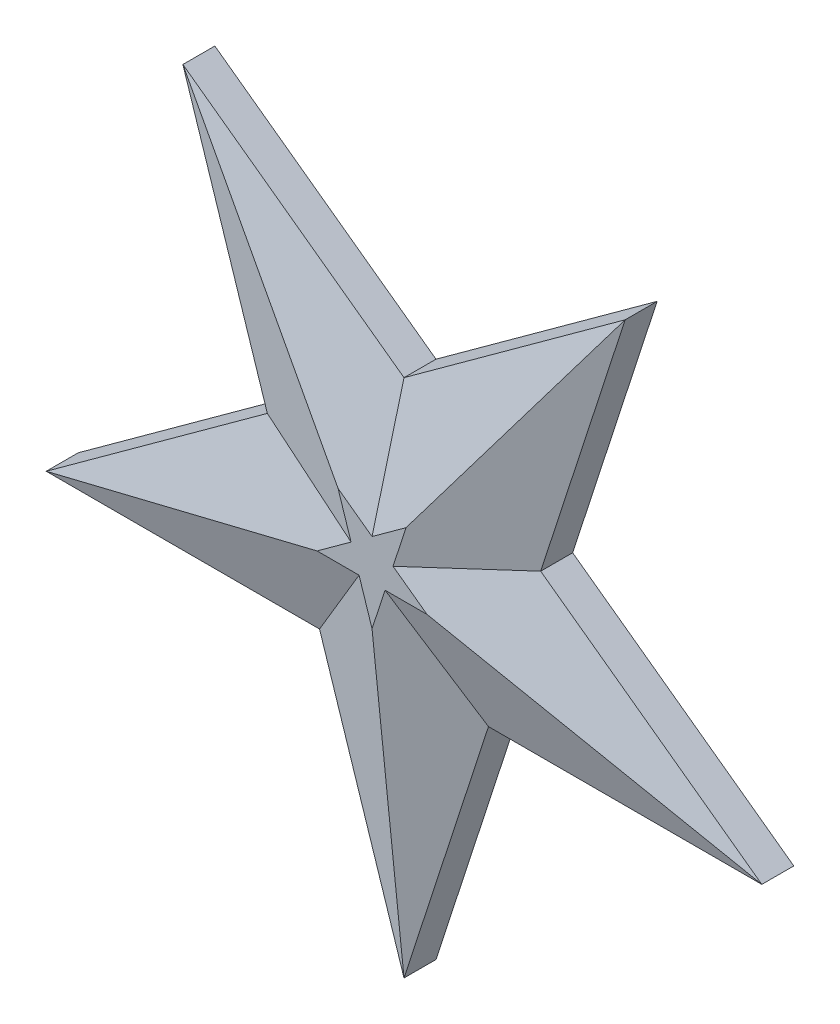
ISO-10303-21;
HEADER;
FILE_DESCRIPTION(('STEP AP214'),'2;1');
FILE_NAME('part.step','',(''),(''),'','','');
FILE_SCHEMA(('AUTOMOTIVE_DESIGN { 1 0 10303 214 1 1 1 1 }'));
ENDSEC;
DATA;
#1=APPLICATION_CONTEXT('core data for automotive mechanical design processes');
#2=APPLICATION_PROTOCOL_DEFINITION('international standard','automotive_design',2000,#1);
#3=PRODUCT_CONTEXT('',#1,'mechanical');
#4=PRODUCT('Part','Part','',(#3));
#5=PRODUCT_RELATED_PRODUCT_CATEGORY('part','',(#4));
#6=PRODUCT_DEFINITION_FORMATION('','',#4);
#7=PRODUCT_DEFINITION_CONTEXT('part definition',#1,'design');
#8=PRODUCT_DEFINITION('design','',#6,#7);
#9=PRODUCT_DEFINITION_SHAPE('','',#8);
#10=(LENGTH_UNIT() NAMED_UNIT(*) SI_UNIT(.MILLI.,.METRE.));
#11=(NAMED_UNIT(*) PLANE_ANGLE_UNIT() SI_UNIT($,.RADIAN.));
#12=(NAMED_UNIT(*) SI_UNIT($,.STERADIAN.) SOLID_ANGLE_UNIT());
#13=UNCERTAINTY_MEASURE_WITH_UNIT(LENGTH_MEASURE(1.E-05),#10,'distance_accuracy_value','');
#14=(GEOMETRIC_REPRESENTATION_CONTEXT(3) GLOBAL_UNCERTAINTY_ASSIGNED_CONTEXT((#13)) GLOBAL_UNIT_ASSIGNED_CONTEXT((#10,
#11,#12)) REPRESENTATION_CONTEXT('',''));
#15=CARTESIAN_POINT('',(0.,0.,0.));
#16=DIRECTION('',(0.,0.,1.));
#17=DIRECTION('',(1.,0.,0.));
#18=AXIS2_PLACEMENT_3D('',#15,#16,#17);
#19=CARTESIAN_POINT('',(-1.06643091403094,-18.9746547741655,2.));
#20=DIRECTION('',(-0.951056516295157,0.309016994374938,0.));
#21=DIRECTION('',(-0.309016994374938,-0.951056516295157,0.));
#22=AXIS2_PLACEMENT_3D('',#19,#20,#21);
#23=PLANE('',#22);
#24=DIRECTION('',(0.309016994374938,0.951056516295157,0.));
#25=VECTOR('',#24,1.);
#26=CARTESIAN_POINT('',(-1.06643091403094,-18.9746547741655,0.));
#27=LINE('',#26,#25);
#28=CARTESIAN_POINT('',(-6.35028036781786,-35.2366712509985,0.));
#29=VERTEX_POINT('',#28);
#30=CARTESIAN_POINT('',(-1.06643091403094,-18.9746547741655,0.));
#31=VERTEX_POINT('',#30);
#32=EDGE_CURVE('E158',#29,#31,#27,.T.);
#33=ORIENTED_EDGE('',*,*,#32,.T.);
#34=DIRECTION('',(0.,0.,-1.));
#35=VECTOR('',#34,1.);
#36=CARTESIAN_POINT('',(-1.06643091403094,-18.9746547741655,2.));
#37=LINE('',#36,#35);
#38=CARTESIAN_POINT('',(-1.06643091403094,-18.9746547741655,2.));
#39=VERTEX_POINT('',#38);
#40=EDGE_CURVE('E11',#39,#31,#37,.T.);
#41=ORIENTED_EDGE('',*,*,#40,.F.);
#42=DIRECTION('',(0.309016994374938,0.951056516295157,0.));
#43=VECTOR('',#42,1.);
#44=CARTESIAN_POINT('',(-1.06643091403094,-18.9746547741655,2.));
#45=LINE('',#44,#43);
#46=CARTESIAN_POINT('',(-6.35028036781785,-35.2366712509985,2.));
#47=VERTEX_POINT('',#46);
#48=EDGE_CURVE('E193',#47,#39,#45,.T.);
#49=ORIENTED_EDGE('',*,*,#48,.F.);
#50=DIRECTION('',(0.,0.,-1.));
#51=VECTOR('',#50,1.);
#52=CARTESIAN_POINT('',(-6.35028036781786,-35.2366712509985,2.));
#53=LINE('',#52,#51);
#54=EDGE_CURVE('E212',#47,#29,#53,.T.);
#55=ORIENTED_EDGE('',*,*,#54,.T.);
#56=EDGE_LOOP('',(#33,#41,#49,#55));
#57=FACE_BOUND('',#56,.T.);
#58=ADVANCED_FACE('F33',(#57),#23,.F.);
#59=CARTESIAN_POINT('',(16.032465101299,-18.9746547741653,2.));
#60=DIRECTION('',(0.,1.,0.));
#61=DIRECTION('',(-1.,0.,0.));
#62=AXIS2_PLACEMENT_3D('',#59,#60,#61);
#63=PLANE('',#62);
#64=DIRECTION('',(1.,0.,0.));
#65=VECTOR('',#64,1.);
#66=CARTESIAN_POINT('',(16.032465101299,-18.9746547741653,0.));
#67=LINE('',#66,#65);
#68=CARTESIAN_POINT('',(16.032465101299,-18.9746547741653,0.));
#69=VERTEX_POINT('',#68);
#70=EDGE_CURVE('E215',#31,#69,#67,.T.);
#71=ORIENTED_EDGE('',*,*,#70,.T.);
#72=DIRECTION('',(0.,0.,-1.));
#73=VECTOR('',#72,1.);
#74=CARTESIAN_POINT('',(16.032465101299,-18.9746547741653,2.));
#75=LINE('',#74,#73);
#76=CARTESIAN_POINT('',(16.032465101299,-18.9746547741653,2.));
#77=VERTEX_POINT('',#76);
#78=EDGE_CURVE('E41',#77,#69,#75,.T.);
#79=ORIENTED_EDGE('',*,*,#78,.F.);
#80=DIRECTION('',(1.,0.,0.));
#81=VECTOR('',#80,1.);
#82=CARTESIAN_POINT('',(16.032465101299,-18.9746547741653,2.));
#83=LINE('',#82,#81);
#84=EDGE_CURVE('E97',#39,#77,#83,.T.);
#85=ORIENTED_EDGE('',*,*,#84,.F.);
#86=ORIENTED_EDGE('',*,*,#40,.T.);
#87=EDGE_LOOP('',(#71,#79,#85,#86));
#88=FACE_BOUND('',#87,.T.);
#89=ADVANCED_FACE('F333',(#88),#63,.F.);
#90=CARTESIAN_POINT('',(2.19916763984696,-8.92417586587219,2.));
#91=DIRECTION('',(-0.587785252292459,-0.809016994374958,0.));
#92=DIRECTION('',(0.809016994374958,-0.587785252292459,0.));
#93=AXIS2_PLACEMENT_3D('',#90,#91,#92);
#94=PLANE('',#93);
#95=DIRECTION('',(-0.809016994374958,0.587785252292459,0.));
#96=VECTOR('',#95,1.);
#97=CARTESIAN_POINT('',(2.19916763984696,-8.92417586587219,0.));
#98=LINE('',#97,#96);
#99=CARTESIAN_POINT('',(2.19916763984696,-8.92417586587219,0.));
#100=VERTEX_POINT('',#99);
#101=EDGE_CURVE('E217',#69,#100,#98,.T.);
#102=ORIENTED_EDGE('',*,*,#101,.T.);
#103=DIRECTION('',(0.,0.,-1.));
#104=VECTOR('',#103,1.);
#105=CARTESIAN_POINT('',(2.19916763984696,-8.92417586587219,2.));
#106=LINE('',#105,#104);
#107=CARTESIAN_POINT('',(2.19916763984696,-8.92417586587219,2.));
#108=VERTEX_POINT('',#107);
#109=EDGE_CURVE('E240',#108,#100,#106,.T.);
#110=ORIENTED_EDGE('',*,*,#109,.F.);
#111=DIRECTION('',(-0.809016994374958,0.587785252292459,0.));
#112=VECTOR('',#111,1.);
#113=CARTESIAN_POINT('',(2.19916763984696,-8.92417586587219,2.));
#114=LINE('',#113,#112);
#115=EDGE_CURVE('E197',#77,#108,#114,.T.);
#116=ORIENTED_EDGE('',*,*,#115,.F.);
#117=ORIENTED_EDGE('',*,*,#78,.T.);
#118=EDGE_LOOP('',(#102,#110,#116,#117));
#119=FACE_BOUND('',#118,.T.);
#120=ADVANCED_FACE('F246',(#119),#94,.F.);
#121=CARTESIAN_POINT('',(7.4830170936339,7.33784061096036,2.));
#122=DIRECTION('',(-0.951056516295154,0.309016994374947,0.));
#123=DIRECTION('',(-0.309016994374947,-0.951056516295154,0.));
#124=AXIS2_PLACEMENT_3D('',#121,#122,#123);
#125=PLANE('',#124);
#126=DIRECTION('',(0.309016994374947,0.951056516295154,0.));
#127=VECTOR('',#126,1.);
#128=CARTESIAN_POINT('',(7.4830170936339,7.33784061096036,0.));
#129=LINE('',#128,#127);
#130=CARTESIAN_POINT('',(7.4830170936339,7.33784061096036,0.));
#131=VERTEX_POINT('',#130);
#132=EDGE_CURVE('E219',#100,#131,#129,.T.);
#133=ORIENTED_EDGE('',*,*,#132,.T.);
#134=DIRECTION('',(0.,0.,-1.));
#135=VECTOR('',#134,1.);
#136=CARTESIAN_POINT('',(7.4830170936339,7.33784061096036,2.));
#137=LINE('',#136,#135);
#138=CARTESIAN_POINT('',(7.4830170936339,7.33784061096036,2.));
#139=VERTEX_POINT('',#138);
#140=EDGE_CURVE('E237',#139,#131,#137,.T.);
#141=ORIENTED_EDGE('',*,*,#140,.F.);
#142=DIRECTION('',(0.309016994374947,0.951056516295154,0.));
#143=VECTOR('',#142,1.);
#144=CARTESIAN_POINT('',(7.4830170936339,7.33784061096036,2.));
#145=LINE('',#144,#143);
#146=EDGE_CURVE('E200',#108,#139,#145,.T.);
#147=ORIENTED_EDGE('',*,*,#146,.F.);
#148=ORIENTED_EDGE('',*,*,#109,.T.);
#149=EDGE_LOOP('',(#133,#141,#147,#148));
#150=FACE_BOUND('',#149,.T.);
#151=ADVANCED_FACE('F254',(#150),#125,.F.);
#152=CARTESIAN_POINT('',(-6.35028036781779,-2.71263829733289,2.));
#153=DIRECTION('',(0.587785252292473,-0.809016994374947,0.));
#154=DIRECTION('',(0.809016994374948,0.587785252292473,0.));
#155=AXIS2_PLACEMENT_3D('',#152,#153,#154);
#156=PLANE('',#155);
#157=DIRECTION('',(-0.809016994374947,-0.587785252292473,0.));
#158=VECTOR('',#157,1.);
#159=CARTESIAN_POINT('',(-6.35028036781779,-2.71263829733289,0.));
#160=LINE('',#159,#158);
#161=CARTESIAN_POINT('',(-6.35028036781779,-2.71263829733289,0.));
#162=VERTEX_POINT('',#161);
#163=EDGE_CURVE('E221',#131,#162,#160,.T.);
#164=ORIENTED_EDGE('',*,*,#163,.T.);
#165=DIRECTION('',(0.,0.,-1.));
#166=VECTOR('',#165,1.);
#167=CARTESIAN_POINT('',(-6.35028036781779,-2.71263829733289,2.));
#168=LINE('',#167,#166);
#169=CARTESIAN_POINT('',(-6.35028036781779,-2.71263829733289,2.));
#170=VERTEX_POINT('',#169);
#171=EDGE_CURVE('E234',#170,#162,#168,.T.);
#172=ORIENTED_EDGE('',*,*,#171,.F.);
#173=DIRECTION('',(-0.809016994374947,-0.587785252292473,0.));
#174=VECTOR('',#173,1.);
#175=CARTESIAN_POINT('',(-6.35028036781779,-2.71263829733289,2.));
#176=LINE('',#175,#174);
#177=EDGE_CURVE('E203',#139,#170,#176,.T.);
#178=ORIENTED_EDGE('',*,*,#177,.F.);
#179=ORIENTED_EDGE('',*,*,#140,.T.);
#180=EDGE_LOOP('',(#164,#172,#178,#179));
#181=FACE_BOUND('',#180,.T.);
#182=ADVANCED_FACE('F258',(#181),#156,.F.);
#183=CARTESIAN_POINT('',(-20.1835778292696,7.33784061096044,2.));
#184=DIRECTION('',(-0.587785252292474,-0.809016994374947,0.));
#185=DIRECTION('',(0.809016994374947,-0.587785252292474,0.));
#186=AXIS2_PLACEMENT_3D('',#183,#184,#185);
#187=PLANE('',#186);
#188=DIRECTION('',(-0.809016994374947,0.587785252292473,0.));
#189=VECTOR('',#188,1.);
#190=CARTESIAN_POINT('',(-20.1835778292696,7.33784061096044,0.));
#191=LINE('',#190,#189);
#192=CARTESIAN_POINT('',(-20.1835778292696,7.33784061096044,0.));
#193=VERTEX_POINT('',#192);
#194=EDGE_CURVE('E223',#162,#193,#191,.T.);
#195=ORIENTED_EDGE('',*,*,#194,.T.);
#196=DIRECTION('',(0.,0.,-1.));
#197=VECTOR('',#196,1.);
#198=CARTESIAN_POINT('',(-20.1835778292696,7.33784061096044,2.));
#199=LINE('',#198,#197);
#200=CARTESIAN_POINT('',(-20.1835778292696,7.33784061096044,2.));
#201=VERTEX_POINT('',#200);
#202=EDGE_CURVE('E129',#201,#193,#199,.T.);
#203=ORIENTED_EDGE('',*,*,#202,.F.);
#204=DIRECTION('',(-0.809016994374947,0.587785252292473,0.));
#205=VECTOR('',#204,1.);
#206=CARTESIAN_POINT('',(-20.1835778292696,7.33784061096044,2.));
#207=LINE('',#206,#205);
#208=EDGE_CURVE('E151',#170,#201,#207,.T.);
#209=ORIENTED_EDGE('',*,*,#208,.F.);
#210=ORIENTED_EDGE('',*,*,#171,.T.);
#211=EDGE_LOOP('',(#195,#203,#209,#210));
#212=FACE_BOUND('',#211,.T.);
#213=ADVANCED_FACE('F346',(#212),#187,.F.);
#214=CARTESIAN_POINT('',(-14.8997283754827,-8.92417586587218,2.));
#215=DIRECTION('',(0.951056516295156,0.30901699437494,0.));
#216=DIRECTION('',(-0.30901699437494,0.951056516295156,0.));
#217=AXIS2_PLACEMENT_3D('',#214,#215,#216);
#218=PLANE('',#217);
#219=DIRECTION('',(0.30901699437494,-0.951056516295156,0.));
#220=VECTOR('',#219,1.);
#221=CARTESIAN_POINT('',(-14.8997283754827,-8.92417586587218,0.));
#222=LINE('',#221,#220);
#223=CARTESIAN_POINT('',(-14.8997283754827,-8.92417586587218,0.));
#224=VERTEX_POINT('',#223);
#225=EDGE_CURVE('E126',#193,#224,#222,.T.);
#226=ORIENTED_EDGE('',*,*,#225,.T.);
#227=DIRECTION('',(0.,0.,-1.));
#228=VECTOR('',#227,1.);
#229=CARTESIAN_POINT('',(-14.8997283754827,-8.92417586587218,2.));
#230=LINE('',#229,#228);
#231=CARTESIAN_POINT('',(-14.8997283754827,-8.92417586587218,2.));
#232=VERTEX_POINT('',#231);
#233=EDGE_CURVE('E118',#232,#224,#230,.T.);
#234=ORIENTED_EDGE('',*,*,#233,.F.);
#235=DIRECTION('',(0.30901699437494,-0.951056516295156,0.));
#236=VECTOR('',#235,1.);
#237=CARTESIAN_POINT('',(-14.8997283754827,-8.92417586587218,2.));
#238=LINE('',#237,#236);
#239=EDGE_CURVE('E123',#201,#232,#238,.T.);
#240=ORIENTED_EDGE('',*,*,#239,.F.);
#241=ORIENTED_EDGE('',*,*,#202,.T.);
#242=EDGE_LOOP('',(#226,#234,#240,#241));
#243=FACE_BOUND('',#242,.T.);
#244=ADVANCED_FACE('F120',(#243),#218,.F.);
#245=CARTESIAN_POINT('',(-28.7330258369345,-18.9746547741655,2.));
#246=DIRECTION('',(0.587785252292474,-0.809016994374947,0.));
#247=DIRECTION('',(0.809016994374947,0.587785252292474,0.));
#248=AXIS2_PLACEMENT_3D('',#245,#246,#247);
#249=PLANE('',#248);
#250=DIRECTION('',(-0.809016994374947,-0.587785252292474,0.));
#251=VECTOR('',#250,1.);
#252=CARTESIAN_POINT('',(-28.7330258369345,-18.9746547741655,0.));
#253=LINE('',#252,#251);
#254=CARTESIAN_POINT('',(-28.7330258369345,-18.9746547741655,0.));
#255=VERTEX_POINT('',#254);
#256=EDGE_CURVE('E226',#224,#255,#253,.T.);
#257=ORIENTED_EDGE('',*,*,#256,.T.);
#258=DIRECTION('',(0.,0.,-1.));
#259=VECTOR('',#258,1.);
#260=CARTESIAN_POINT('',(-28.7330258369345,-18.9746547741655,2.));
#261=LINE('',#260,#259);
#262=CARTESIAN_POINT('',(-28.7330258369345,-18.9746547741655,2.));
#263=VERTEX_POINT('',#262);
#264=EDGE_CURVE('E130',#263,#255,#261,.T.);
#265=ORIENTED_EDGE('',*,*,#264,.F.);
#266=DIRECTION('',(-0.809016994374947,-0.587785252292474,0.));
#267=VECTOR('',#266,1.);
#268=CARTESIAN_POINT('',(-28.7330258369345,-18.9746547741655,2.));
#269=LINE('',#268,#267);
#270=EDGE_CURVE('E133',#232,#263,#269,.T.);
#271=ORIENTED_EDGE('',*,*,#270,.F.);
#272=ORIENTED_EDGE('',*,*,#233,.T.);
#273=EDGE_LOOP('',(#257,#265,#271,#272));
#274=FACE_BOUND('',#273,.T.);
#275=ADVANCED_FACE('F134',(#274),#249,.F.);
#276=CARTESIAN_POINT('',(-11.6341298216048,-18.9746547741655,2.));
#277=DIRECTION('',(0.,1.,0.));
#278=DIRECTION('',(-1.,0.,0.));
#279=AXIS2_PLACEMENT_3D('',#276,#277,#278);
#280=PLANE('',#279);
#281=DIRECTION('',(1.,0.,0.));
#282=VECTOR('',#281,1.);
#283=CARTESIAN_POINT('',(-11.6341298216048,-18.9746547741655,0.));
#284=LINE('',#283,#282);
#285=CARTESIAN_POINT('',(-11.6341298216048,-18.9746547741655,0.));
#286=VERTEX_POINT('',#285);
#287=EDGE_CURVE('E83',#255,#286,#284,.T.);
#288=ORIENTED_EDGE('',*,*,#287,.T.);
#289=DIRECTION('',(0.,0.,-1.));
#290=VECTOR('',#289,1.);
#291=CARTESIAN_POINT('',(-11.6341298216048,-18.9746547741655,2.));
#292=LINE('',#291,#290);
#293=CARTESIAN_POINT('',(-11.6341298216048,-18.9746547741655,2.));
#294=VERTEX_POINT('',#293);
#295=EDGE_CURVE('E49',#294,#286,#292,.T.);
#296=ORIENTED_EDGE('',*,*,#295,.F.);
#297=DIRECTION('',(1.,0.,0.));
#298=VECTOR('',#297,1.);
#299=CARTESIAN_POINT('',(-11.6341298216048,-18.9746547741655,2.));
#300=LINE('',#299,#298);
#301=EDGE_CURVE('E139',#263,#294,#300,.T.);
#302=ORIENTED_EDGE('',*,*,#301,.F.);
#303=ORIENTED_EDGE('',*,*,#264,.T.);
#304=EDGE_LOOP('',(#288,#296,#302,#303));
#305=FACE_BOUND('',#304,.T.);
#306=ADVANCED_FACE('F323',(#305),#280,.F.);
#307=CARTESIAN_POINT('',(-6.35028036781786,-35.2366712509985,2.));
#308=DIRECTION('',(0.951056516295156,0.30901699437494,0.));
#309=DIRECTION('',(-0.30901699437494,0.951056516295156,0.));
#310=AXIS2_PLACEMENT_3D('',#307,#308,#309);
#311=PLANE('',#310);
#312=DIRECTION('',(0.30901699437494,-0.951056516295156,0.));
#313=VECTOR('',#312,1.);
#314=CARTESIAN_POINT('',(-6.35028036781786,-35.2366712509985,0.));
#315=LINE('',#314,#313);
#316=EDGE_CURVE('E89',#286,#29,#315,.T.);
#317=ORIENTED_EDGE('',*,*,#316,.T.);
#318=ORIENTED_EDGE('',*,*,#54,.F.);
#319=DIRECTION('',(0.30901699437494,-0.951056516295156,0.));
#320=VECTOR('',#319,1.);
#321=CARTESIAN_POINT('',(-6.35028036781786,-35.2366712509985,2.));
#322=LINE('',#321,#320);
#323=EDGE_CURVE('E209',#294,#47,#322,.T.);
#324=ORIENTED_EDGE('',*,*,#323,.F.);
#325=ORIENTED_EDGE('',*,*,#295,.T.);
#326=EDGE_LOOP('',(#317,#318,#324,#325));
#327=FACE_BOUND('',#326,.T.);
#328=ADVANCED_FACE('F322',(#327),#311,.F.);
#329=CARTESIAN_POINT('',(0.,0.,0.));
#330=DIRECTION('',(0.,0.,-1.));
#331=DIRECTION('',(-1.,0.,0.));
#332=AXIS2_PLACEMENT_3D('',#329,#330,#331);
#333=PLANE('',#332);
#334=ORIENTED_EDGE('',*,*,#32,.F.);
#335=ORIENTED_EDGE('',*,*,#316,.F.);
#336=ORIENTED_EDGE('',*,*,#287,.F.);
#337=ORIENTED_EDGE('',*,*,#256,.F.);
#338=ORIENTED_EDGE('',*,*,#225,.F.);
#339=ORIENTED_EDGE('',*,*,#194,.F.);
#340=ORIENTED_EDGE('',*,*,#163,.F.);
#341=ORIENTED_EDGE('',*,*,#132,.F.);
#342=ORIENTED_EDGE('',*,*,#101,.F.);
#343=ORIENTED_EDGE('',*,*,#70,.F.);
#344=EDGE_LOOP('',(#334,#335,#336,#337,#338,#339,#340,#341,#342,#343));
#345=FACE_BOUND('',#344,.T.);
#346=ADVANCED_FACE('F250',(#345),#333,.T.);
#347=CARTESIAN_POINT('',(-3.48390407207337,-4.79518257745768,2.));
#348=DIRECTION('',(0.181635632001339,0.249999999999998,0.951056516295154));
#349=DIRECTION('',(0.,-0.967144085812848,0.254228867906914));
#350=AXIS2_PLACEMENT_3D('',#347,#348,#349);
#351=PLANE('',#350);
#352=ORIENTED_EDGE('',*,*,#208,.T.);
#353=DIRECTION('',(-0.584844646020874,0.8049695970675,-0.0999033924234067));
#354=VECTOR('',#353,1.);
#355=CARTESIAN_POINT('',(-12.8694737047082,-2.72916007052962,3.24939814282858));
#356=LINE('',#355,#354);
#357=CARTESIAN_POINT('',(-8.4753738967703,-8.77711960292118,4.));
#358=VERTEX_POINT('',#357);
#359=EDGE_CURVE('E149',#358,#201,#356,.T.);
#360=ORIENTED_EDGE('',*,*,#359,.F.);
#361=DIRECTION('',(0.809016994374947,-0.587785252292474,0.));
#362=VECTOR('',#361,1.);
#363=CARTESIAN_POINT('',(-7.1019380608233,-9.77497914722328,4.));
#364=LINE('',#363,#362);
#365=CARTESIAN_POINT('',(-6.35028036781779,-10.3210904276942,4.));
#366=VERTEX_POINT('',#365);
#367=EDGE_CURVE('E164',#366,#358,#364,.F.);
#368=ORIENTED_EDGE('',*,*,#367,.F.);
#369=DIRECTION('',(0.,0.967144085812848,-0.254228867906914));
#370=VECTOR('',#369,1.);
#371=CARTESIAN_POINT('',(-6.35028036781779,0.988547311050891,1.02708578697254));
#372=LINE('',#371,#370);
#373=EDGE_CURVE('E192',#366,#170,#372,.T.);
#374=ORIENTED_EDGE('',*,*,#373,.T.);
#375=EDGE_LOOP('',(#352,#360,#368,#374));
#376=FACE_BOUND('',#375,.T.);
#377=ADVANCED_FACE('F315',(#376),#351,.T.);
#378=CARTESIAN_POINT('',(-16.0996804028215,-5.2311032659315,2.));
#379=DIRECTION('',(-0.293892626146235,-0.0954915028125235,0.951056516295154));
#380=DIRECTION('',(0.955422563220239,0.,0.295241808844325));
#381=AXIS2_PLACEMENT_3D('',#378,#379,#380);
#382=PLANE('',#381);
#383=ORIENTED_EDGE('',*,*,#239,.T.);
#384=DIRECTION('',(-0.919808685008627,0.298863958525395,-0.254228867906915));
#385=VECTOR('',#384,1.);
#386=CARTESIAN_POINT('',(-16.9301624419745,-8.26444784576673,1.43880182640482));
#387=LINE('',#386,#385);
#388=CARTESIAN_POINT('',(-7.66366039798292,-11.2753168750421,4.));
#389=VERTEX_POINT('',#388);
#390=EDGE_CURVE('E146',#389,#232,#387,.T.);
#391=ORIENTED_EDGE('',*,*,#390,.F.);
#392=DIRECTION('',(-0.30901699437494,0.951056516295156,0.));
#393=VECTOR('',#392,1.);
#394=CARTESIAN_POINT('',(-10.2455784365718,-3.32899023334123,4.));
#395=LINE('',#394,#393);
#396=EDGE_CURVE('E167',#358,#389,#395,.F.);
#397=ORIENTED_EDGE('',*,*,#396,.F.);
#398=ORIENTED_EDGE('',*,*,#359,.T.);
#399=EDGE_LOOP('',(#383,#391,#397,#398));
#400=FACE_BOUND('',#399,.T.);
#401=ADVANCED_FACE('F143',(#400),#382,.T.);
#402=CARTESIAN_POINT('',(-0.904031743043147,1.24429294665663,2.));
#403=DIRECTION('',(-0.181635632001339,0.249999999999998,0.951056516295154));
#404=DIRECTION('',(0.,-0.967144085812848,0.254228867906914));
#405=AXIS2_PLACEMENT_3D('',#402,#403,#404);
#406=PLANE('',#405);
#407=ORIENTED_EDGE('',*,*,#270,.T.);
#408=DIRECTION('',(-0.94629851540018,-0.307471026169477,-0.099903392423406));
#409=VECTOR('',#408,1.);
#410=CARTESIAN_POINT('',(-3.00315056827111,-10.6145115177608,4.71637520733458));
#411=LINE('',#410,#409);
#412=CARTESIAN_POINT('',(-9.78875392693524,-12.819287699815,4.));
#413=VERTEX_POINT('',#412);
#414=EDGE_CURVE('E156',#413,#263,#411,.T.);
#415=ORIENTED_EDGE('',*,*,#414,.F.);
#416=DIRECTION('',(0.809016994374947,0.587785252292474,0.));
#417=VECTOR('',#416,1.);
#418=CARTESIAN_POINT('',(2.71400224570678,-3.73550362310896,4.));
#419=LINE('',#418,#417);
#420=EDGE_CURVE('E155',#389,#413,#419,.F.);
#421=ORIENTED_EDGE('',*,*,#420,.F.);
#422=ORIENTED_EDGE('',*,*,#390,.T.);
#423=EDGE_LOOP('',(#407,#415,#421,#422));
#424=FACE_BOUND('',#423,.T.);
#425=ADVANCED_FACE('F153',(#424),#406,.T.);
#426=CARTESIAN_POINT('',(0.,-18.9746547741655,2.));
#427=DIRECTION('',(0.,-0.309016994374945,0.951056516295154));
#428=DIRECTION('',(0.,-0.951056516295154,-0.309016994374945));
#429=AXIS2_PLACEMENT_3D('',#426,#427,#428);
#430=PLANE('',#429);
#431=ORIENTED_EDGE('',*,*,#301,.T.);
#432=DIRECTION('',(-0.568473030482681,-0.782436001431814,-0.254228867906913));
#433=VECTOR('',#432,1.);
#434=CARTESIAN_POINT('',(-7.87442597223244,-13.7998663695635,3.68139067649283));
#435=LINE('',#434,#433);
#436=CARTESIAN_POINT('',(-7.16199386660517,-12.819287699815,4.));
#437=VERTEX_POINT('',#436);
#438=EDGE_CURVE('E160',#437,#294,#435,.T.);
#439=ORIENTED_EDGE('',*,*,#438,.F.);
#440=DIRECTION('',(-1.,0.,0.));
#441=VECTOR('',#440,1.);
#442=CARTESIAN_POINT('',(0.,-12.819287699815,4.));
#443=LINE('',#442,#441);
#444=EDGE_CURVE('E171',#413,#437,#443,.F.);
#445=ORIENTED_EDGE('',*,*,#444,.F.);
#446=ORIENTED_EDGE('',*,*,#414,.T.);
#447=EDGE_LOOP('',(#431,#439,#445,#446));
#448=FACE_BOUND('',#447,.T.);
#449=ADVANCED_FACE('F297',(#448),#430,.T.);
#450=CARTESIAN_POINT('',(-16.0996804028214,-5.23110326593148,2.));
#451=DIRECTION('',(-0.293892626146235,-0.0954915028125235,0.951056516295154));
#452=DIRECTION('',(0.955422563220239,0.,0.295241808844325));
#453=AXIS2_PLACEMENT_3D('',#450,#451,#452);
#454=PLANE('',#453);
#455=ORIENTED_EDGE('',*,*,#323,.T.);
#456=DIRECTION('',(0.,-0.994997141796043,-0.099903392423403));
#457=VECTOR('',#456,1.);
#458=CARTESIAN_POINT('',(-6.3502803678179,-1.83523225146508,5.35369512906677));
#459=LINE('',#458,#457);
#460=CARTESIAN_POINT('',(-6.35028036781788,-15.3174849719356,4.));
#461=VERTEX_POINT('',#460);
#462=EDGE_CURVE('E285',#461,#47,#459,.T.);
#463=ORIENTED_EDGE('',*,*,#462,.F.);
#464=DIRECTION('',(-0.30901699437494,0.951056516295156,0.));
#465=VECTOR('',#464,1.);
#466=CARTESIAN_POINT('',(-10.2455784365717,-3.3289902333412,4.));
#467=LINE('',#466,#465);
#468=EDGE_CURVE('E174',#437,#461,#467,.F.);
#469=ORIENTED_EDGE('',*,*,#468,.F.);
#470=ORIENTED_EDGE('',*,*,#438,.T.);
#471=EDGE_LOOP('',(#455,#463,#469,#470));
#472=FACE_BOUND('',#471,.T.);
#473=ADVANCED_FACE('F291',(#472),#454,.T.);
#474=CARTESIAN_POINT('',(4.61191529839318,-1.49850211780576,2.));
#475=DIRECTION('',(0.293892626146236,-0.0954915028125228,0.951056516295154));
#476=DIRECTION('',(0.955422563220239,0.,-0.295241808844325));
#477=AXIS2_PLACEMENT_3D('',#474,#475,#476);
#478=PLANE('',#477);
#479=ORIENTED_EDGE('',*,*,#48,.T.);
#480=DIRECTION('',(0.568473030482687,-0.78243600143181,-0.254228867906914));
#481=VECTOR('',#480,1.);
#482=CARTESIAN_POINT('',(-7.00469127983582,-10.8013405676213,4.65567076920644));
#483=LINE('',#482,#481);
#484=CARTESIAN_POINT('',(-5.53856686903061,-12.819287699815,4.));
#485=VERTEX_POINT('',#484);
#486=EDGE_CURVE('E282',#485,#39,#483,.T.);
#487=ORIENTED_EDGE('',*,*,#486,.F.);
#488=DIRECTION('',(-0.309016994374938,-0.951056516295157,0.));
#489=VECTOR('',#488,1.);
#490=CARTESIAN_POINT('',(-1.24218666785656,0.403610914784507,4.));
#491=LINE('',#490,#489);
#492=EDGE_CURVE('E177',#461,#485,#491,.F.);
#493=ORIENTED_EDGE('',*,*,#492,.F.);
#494=ORIENTED_EDGE('',*,*,#462,.T.);
#495=EDGE_LOOP('',(#479,#487,#493,#494));
#496=FACE_BOUND('',#495,.T.);
#497=ADVANCED_FACE('F412',(#496),#478,.T.);
#498=CARTESIAN_POINT('',(2.34852884350332E-13,-18.9746547741655,2.));
#499=DIRECTION('',(0.,-0.309016994374945,0.951056516295154));
#500=DIRECTION('',(0.,-0.951056516295154,-0.309016994374945));
#501=AXIS2_PLACEMENT_3D('',#498,#499,#500);
#502=PLANE('',#501);
#503=ORIENTED_EDGE('',*,*,#84,.T.);
#504=DIRECTION('',(0.946298515400185,-0.307471026169462,-0.0999033924234048));
#505=VECTOR('',#504,1.);
#506=CARTESIAN_POINT('',(-5.56972072191754,-11.9556791185194,4.28060343789872));
#507=LINE('',#506,#505);
#508=CARTESIAN_POINT('',(-2.91180680870057,-12.819287699815,4.));
#509=VERTEX_POINT('',#508);
#510=EDGE_CURVE('E276',#509,#77,#507,.T.);
#511=ORIENTED_EDGE('',*,*,#510,.F.);
#512=DIRECTION('',(-1.,0.,0.));
#513=VECTOR('',#512,1.);
#514=CARTESIAN_POINT('',(1.58666744004078E-13,-12.8192876998149,4.));
#515=LINE('',#514,#513);
#516=EDGE_CURVE('E180',#485,#509,#515,.F.);
#517=ORIENTED_EDGE('',*,*,#516,.F.);
#518=ORIENTED_EDGE('',*,*,#486,.T.);
#519=EDGE_LOOP('',(#503,#511,#517,#518));
#520=FACE_BOUND('',#519,.T.);
#521=ADVANCED_FACE('F421',(#520),#502,.T.);
#522=CARTESIAN_POINT('',(-3.48390407207343,-4.79518257745795,2.));
#523=DIRECTION('',(0.181635632001335,0.250000000000002,0.951056516295154));
#524=DIRECTION('',(0.,-0.967144085812847,0.254228867906917));
#525=AXIS2_PLACEMENT_3D('',#522,#523,#524);
#526=PLANE('',#525);
#527=ORIENTED_EDGE('',*,*,#115,.T.);
#528=DIRECTION('',(0.919808685008626,0.298863958525401,-0.254228867906912));
#529=VECTOR('',#528,1.);
#530=CARTESIAN_POINT('',(-1.47393330009403,-10.1176387075107,3.01522013097784));
#531=LINE('',#530,#529);
#532=CARTESIAN_POINT('',(-5.0369003376529,-11.2753168750422,4.));
#533=VERTEX_POINT('',#532);
#534=EDGE_CURVE('E273',#533,#108,#531,.T.);
#535=ORIENTED_EDGE('',*,*,#534,.F.);
#536=DIRECTION('',(0.809016994374958,-0.587785252292459,0.));
#537=VECTOR('',#536,1.);
#538=CARTESIAN_POINT('',(-7.10193806082326,-9.77497914722361,4.));
#539=LINE('',#538,#537);
#540=EDGE_CURVE('E183',#509,#533,#539,.F.);
#541=ORIENTED_EDGE('',*,*,#540,.F.);
#542=ORIENTED_EDGE('',*,*,#510,.T.);
#543=EDGE_LOOP('',(#527,#535,#541,#542));
#544=FACE_BOUND('',#543,.T.);
#545=ADVANCED_FACE('F430',(#544),#526,.T.);
#546=CARTESIAN_POINT('',(4.61191529839334,-1.49850211780585,2.));
#547=DIRECTION('',(0.293892626146235,-0.0954915028125255,0.951056516295154));
#548=DIRECTION('',(0.955422563220239,0.,-0.295241808844324));
#549=AXIS2_PLACEMENT_3D('',#546,#547,#548);
#550=PLANE('',#549);
#551=ORIENTED_EDGE('',*,*,#146,.T.);
#552=DIRECTION('',(0.584844646020877,0.804969597067498,-0.0999033924234058));
#553=VECTOR('',#552,1.);
#554=CARTESIAN_POINT('',(1.74555004222894,-0.55910530789248,2.98007637797955));
#555=LINE('',#554,#553);
#556=CARTESIAN_POINT('',(-4.22518683886554,-8.77711960292137,4.));
#557=VERTEX_POINT('',#556);
#558=EDGE_CURVE('E270',#557,#139,#555,.T.);
#559=ORIENTED_EDGE('',*,*,#558,.F.);
#560=DIRECTION('',(-0.309016994374947,-0.951056516295154,0.));
#561=VECTOR('',#560,1.);
#562=CARTESIAN_POINT('',(-1.24218666785639,0.403610914784463,4.));
#563=LINE('',#562,#561);
#564=EDGE_CURVE('E186',#533,#557,#563,.F.);
#565=ORIENTED_EDGE('',*,*,#564,.F.);
#566=ORIENTED_EDGE('',*,*,#534,.T.);
#567=EDGE_LOOP('',(#551,#559,#565,#566));
#568=FACE_BOUND('',#567,.T.);
#569=ADVANCED_FACE('F267',(#568),#550,.T.);
#570=CARTESIAN_POINT('',(-0.90403174304313,1.24429294665661,2.));
#571=DIRECTION('',(-0.181635632001339,0.249999999999998,0.951056516295154));
#572=DIRECTION('',(0.,-0.967144085812848,0.254228867906914));
#573=AXIS2_PLACEMENT_3D('',#570,#571,#572);
#574=PLANE('',#573);
#575=ORIENTED_EDGE('',*,*,#177,.T.);
#576=ORIENTED_EDGE('',*,*,#373,.F.);
#577=DIRECTION('',(0.809016994374948,0.587785252292473,0.));
#578=VECTOR('',#577,1.);
#579=CARTESIAN_POINT('',(2.71400224570679,-3.73550362310899,4.));
#580=LINE('',#579,#578);
#581=EDGE_CURVE('E189',#557,#366,#580,.F.);
#582=ORIENTED_EDGE('',*,*,#581,.F.);
#583=ORIENTED_EDGE('',*,*,#558,.T.);
#584=EDGE_LOOP('',(#575,#576,#582,#583));
#585=FACE_BOUND('',#584,.T.);
#586=ADVANCED_FACE('F274',(#585),#574,.T.);
#587=CARTESIAN_POINT('',(0.,0.,4.));
#588=DIRECTION('',(0.,0.,1.));
#589=DIRECTION('',(1.,0.,0.));
#590=AXIS2_PLACEMENT_3D('',#587,#588,#589);
#591=PLANE('',#590);
#592=ORIENTED_EDGE('',*,*,#367,.T.);
#593=ORIENTED_EDGE('',*,*,#396,.T.);
#594=ORIENTED_EDGE('',*,*,#420,.T.);
#595=ORIENTED_EDGE('',*,*,#444,.T.);
#596=ORIENTED_EDGE('',*,*,#468,.T.);
#597=ORIENTED_EDGE('',*,*,#492,.T.);
#598=ORIENTED_EDGE('',*,*,#516,.T.);
#599=ORIENTED_EDGE('',*,*,#540,.T.);
#600=ORIENTED_EDGE('',*,*,#564,.T.);
#601=ORIENTED_EDGE('',*,*,#581,.T.);
#602=EDGE_LOOP('',(#592,#593,#594,#595,#596,#597,#598,#599,#600,#601));
#603=FACE_BOUND('',#602,.T.);
#604=ADVANCED_FACE('F311',(#603),#591,.T.);
#605=CLOSED_SHELL('',(#58,#89,#120,#151,#182,#213,#244,#275,#306,#328,#346,#377,#401,#425,#449,
#473,#497,#521,#545,#569,#586,#604));
#606=MANIFOLD_SOLID_BREP('B2',#605);
#607=ADVANCED_BREP_SHAPE_REPRESENTATION('',(#18,#606),#14);
#608=SHAPE_DEFINITION_REPRESENTATION(#9,#607);
ENDSEC;
END-ISO-10303-21;
